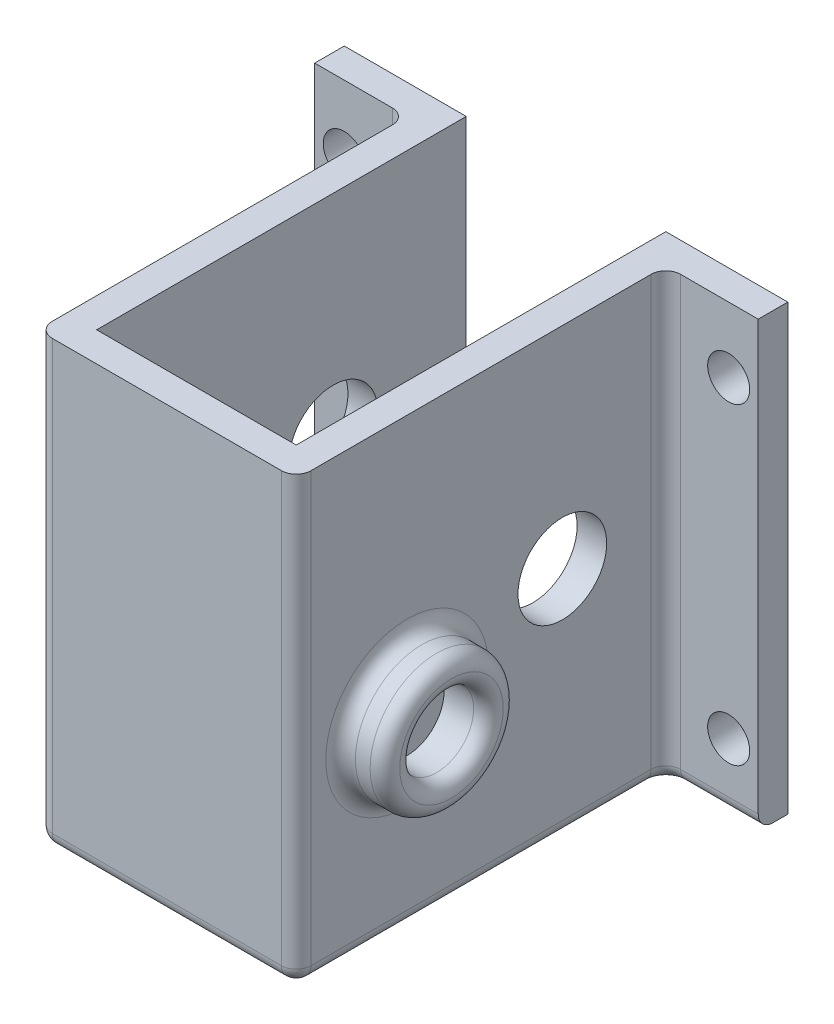
ISO-10303-21;
HEADER;
FILE_DESCRIPTION(('STEP AP214'),'2;1');
FILE_NAME('part.step','',(''),(''),'','','');
FILE_SCHEMA(('AUTOMOTIVE_DESIGN { 1 0 10303 214 1 1 1 1 }'));
ENDSEC;
DATA;
#1=APPLICATION_CONTEXT('core data for automotive mechanical design processes');
#2=APPLICATION_PROTOCOL_DEFINITION('international standard','automotive_design',2000,#1);
#3=PRODUCT_CONTEXT('',#1,'mechanical');
#4=PRODUCT('Part','Part','',(#3));
#5=PRODUCT_RELATED_PRODUCT_CATEGORY('part','',(#4));
#6=PRODUCT_DEFINITION_FORMATION('','',#4);
#7=PRODUCT_DEFINITION_CONTEXT('part definition',#1,'design');
#8=PRODUCT_DEFINITION('design','',#6,#7);
#9=PRODUCT_DEFINITION_SHAPE('','',#8);
#10=(LENGTH_UNIT() NAMED_UNIT(*) SI_UNIT(.MILLI.,.METRE.));
#11=(NAMED_UNIT(*) PLANE_ANGLE_UNIT() SI_UNIT($,.RADIAN.));
#12=(NAMED_UNIT(*) SI_UNIT($,.STERADIAN.) SOLID_ANGLE_UNIT());
#13=UNCERTAINTY_MEASURE_WITH_UNIT(LENGTH_MEASURE(1.E-05),#10,'distance_accuracy_value','');
#14=(GEOMETRIC_REPRESENTATION_CONTEXT(3) GLOBAL_UNCERTAINTY_ASSIGNED_CONTEXT((#13)) GLOBAL_UNIT_ASSIGNED_CONTEXT((#10,
#11,#12)) REPRESENTATION_CONTEXT('',''));
#15=CARTESIAN_POINT('',(0.,0.,0.));
#16=DIRECTION('',(0.,0.,1.));
#17=DIRECTION('',(1.,0.,0.));
#18=AXIS2_PLACEMENT_3D('',#15,#16,#17);
#19=CARTESIAN_POINT('',(-8.75,2.,13.5));
#20=DIRECTION('',(1.,0.,0.));
#21=DIRECTION('',(0.,0.,-1.));
#22=AXIS2_PLACEMENT_3D('',#19,#20,#21);
#23=PLANE('',#22);
#24=CARTESIAN_POINT('',(-8.75,15.76,-4.5));
#25=DIRECTION('',(1.,0.,0.));
#26=DIRECTION('',(0.,0.,-1.));
#27=AXIS2_PLACEMENT_3D('',#24,#25,#26);
#28=CIRCLE('',#27,3.);
#29=CARTESIAN_POINT('',(-8.75,15.76,-7.5));
#30=VERTEX_POINT('',#29);
#31=EDGE_CURVE('E203',#30,#30,#28,.T.);
#32=ORIENTED_EDGE('',*,*,#31,.T.);
#33=EDGE_LOOP('',(#32));
#34=FACE_BOUND('',#33,.T.);
#35=DIRECTION('',(0.,0.,1.));
#36=VECTOR('',#35,1.);
#37=CARTESIAN_POINT('',(-8.75,30.,-13.5));
#38=LINE('',#37,#36);
#39=CARTESIAN_POINT('',(-8.75,30.,-10.5));
#40=VERTEX_POINT('',#39);
#41=CARTESIAN_POINT('',(-8.75,30.,12.5));
#42=VERTEX_POINT('',#41);
#43=EDGE_CURVE('E244',#40,#42,#38,.T.);
#44=ORIENTED_EDGE('',*,*,#43,.F.);
#45=DIRECTION('',(0.,1.,0.));
#46=VECTOR('',#45,1.);
#47=CARTESIAN_POINT('',(-8.75,0.,-10.5));
#48=LINE('',#47,#46);
#49=CARTESIAN_POINT('',(-8.75,1.,-10.5));
#50=VERTEX_POINT('',#49);
#51=EDGE_CURVE('E360',#40,#50,#48,.F.);
#52=ORIENTED_EDGE('',*,*,#51,.T.);
#53=DIRECTION('',(0.,0.,1.));
#54=VECTOR('',#53,1.);
#55=CARTESIAN_POINT('',(-8.75,1.,13.5));
#56=LINE('',#55,#54);
#57=CARTESIAN_POINT('',(-8.75,1.,12.5));
#58=VERTEX_POINT('',#57);
#59=EDGE_CURVE('E357',#50,#58,#56,.T.);
#60=ORIENTED_EDGE('',*,*,#59,.T.);
#61=DIRECTION('',(0.,-1.,0.));
#62=VECTOR('',#61,1.);
#63=CARTESIAN_POINT('',(-8.75,2.,12.5));
#64=LINE('',#63,#62);
#65=EDGE_CURVE('E354',#58,#42,#64,.F.);
#66=ORIENTED_EDGE('',*,*,#65,.T.);
#67=EDGE_LOOP('',(#44,#52,#60,#66));
#68=FACE_BOUND('',#67,.T.);
#69=ADVANCED_FACE('F41',(#34,#68),#23,.F.);
#70=CARTESIAN_POINT('',(8.75,2.,13.5));
#71=DIRECTION('',(0.,0.,-1.));
#72=DIRECTION('',(-1.,0.,0.));
#73=AXIS2_PLACEMENT_3D('',#70,#71,#72);
#74=PLANE('',#73);
#75=DIRECTION('',(1.,0.,0.));
#76=VECTOR('',#75,1.);
#77=CARTESIAN_POINT('',(-8.75,30.,13.5));
#78=LINE('',#77,#76);
#79=CARTESIAN_POINT('',(-7.75,30.,13.5));
#80=VERTEX_POINT('',#79);
#81=CARTESIAN_POINT('',(7.75,30.,13.5));
#82=VERTEX_POINT('',#81);
#83=EDGE_CURVE('E248',#80,#82,#78,.T.);
#84=ORIENTED_EDGE('',*,*,#83,.F.);
#85=DIRECTION('',(0.,-1.,0.));
#86=VECTOR('',#85,1.);
#87=CARTESIAN_POINT('',(-7.75,2.,13.5));
#88=LINE('',#87,#86);
#89=CARTESIAN_POINT('',(-7.75,1.,13.5));
#90=VERTEX_POINT('',#89);
#91=EDGE_CURVE('E59',#80,#90,#88,.T.);
#92=ORIENTED_EDGE('',*,*,#91,.T.);
#93=DIRECTION('',(1.,0.,0.));
#94=VECTOR('',#93,1.);
#95=CARTESIAN_POINT('',(8.75,1.,13.5));
#96=LINE('',#95,#94);
#97=CARTESIAN_POINT('',(7.75,1.,13.5));
#98=VERTEX_POINT('',#97);
#99=EDGE_CURVE('E64',#90,#98,#96,.T.);
#100=ORIENTED_EDGE('',*,*,#99,.T.);
#101=DIRECTION('',(0.,-1.,0.));
#102=VECTOR('',#101,1.);
#103=CARTESIAN_POINT('',(7.75,2.,13.5));
#104=LINE('',#103,#102);
#105=EDGE_CURVE('E363',#98,#82,#104,.F.);
#106=ORIENTED_EDGE('',*,*,#105,.T.);
#107=EDGE_LOOP('',(#84,#92,#100,#106));
#108=FACE_BOUND('',#107,.T.);
#109=ADVANCED_FACE('F519',(#108),#74,.F.);
#110=CARTESIAN_POINT('',(8.75,2.,13.5));
#111=DIRECTION('',(-1.,0.,0.));
#112=DIRECTION('',(0.,0.,1.));
#113=AXIS2_PLACEMENT_3D('',#110,#111,#112);
#114=PLANE('',#113);
#115=CARTESIAN_POINT('',(8.75,12.56,6.00000000000001));
#116=DIRECTION('',(-1.,0.,0.));
#117=DIRECTION('',(0.,0.,1.));
#118=AXIS2_PLACEMENT_3D('',#115,#116,#117);
#119=CIRCLE('',#118,5.5);
#120=CARTESIAN_POINT('',(8.75,12.56,11.5));
#121=VERTEX_POINT('',#120);
#122=EDGE_CURVE('E341',#121,#121,#119,.T.);
#123=ORIENTED_EDGE('',*,*,#122,.T.);
#124=EDGE_LOOP('',(#123));
#125=FACE_BOUND('',#124,.T.);
#126=CARTESIAN_POINT('',(8.75,15.76,-4.5));
#127=DIRECTION('',(-1.,0.,0.));
#128=DIRECTION('',(0.,0.,1.));
#129=AXIS2_PLACEMENT_3D('',#126,#127,#128);
#130=CIRCLE('',#129,3.);
#131=CARTESIAN_POINT('',(8.75,15.76,-1.5));
#132=VERTEX_POINT('',#131);
#133=EDGE_CURVE('E494',#132,#132,#130,.T.);
#134=ORIENTED_EDGE('',*,*,#133,.T.);
#135=EDGE_LOOP('',(#134));
#136=FACE_BOUND('',#135,.T.);
#137=DIRECTION('',(0.,0.,-1.));
#138=VECTOR('',#137,1.);
#139=CARTESIAN_POINT('',(8.75,1.,13.5));
#140=LINE('',#139,#138);
#141=CARTESIAN_POINT('',(8.75,1.,12.5));
#142=VERTEX_POINT('',#141);
#143=CARTESIAN_POINT('',(8.75,1.,-10.5));
#144=VERTEX_POINT('',#143);
#145=EDGE_CURVE('E348',#142,#144,#140,.T.);
#146=ORIENTED_EDGE('',*,*,#145,.T.);
#147=DIRECTION('',(0.,1.,0.));
#148=VECTOR('',#147,1.);
#149=CARTESIAN_POINT('',(8.75,2.,-10.5));
#150=LINE('',#149,#148);
#151=CARTESIAN_POINT('',(8.75,30.,-10.5));
#152=VERTEX_POINT('',#151);
#153=EDGE_CURVE('E351',#144,#152,#150,.T.);
#154=ORIENTED_EDGE('',*,*,#153,.T.);
#155=DIRECTION('',(0.,0.,-1.));
#156=VECTOR('',#155,1.);
#157=CARTESIAN_POINT('',(8.75,30.,13.5));
#158=LINE('',#157,#156);
#159=CARTESIAN_POINT('',(8.75,30.,12.5));
#160=VERTEX_POINT('',#159);
#161=EDGE_CURVE('E193',#160,#152,#158,.T.);
#162=ORIENTED_EDGE('',*,*,#161,.F.);
#163=DIRECTION('',(0.,-1.,0.));
#164=VECTOR('',#163,1.);
#165=CARTESIAN_POINT('',(8.75,2.,12.5));
#166=LINE('',#165,#164);
#167=EDGE_CURVE('E345',#160,#142,#166,.T.);
#168=ORIENTED_EDGE('',*,*,#167,.T.);
#169=EDGE_LOOP('',(#146,#154,#162,#168));
#170=FACE_BOUND('',#169,.T.);
#171=ADVANCED_FACE('F524',(#125,#136,#170),#114,.F.);
#172=CARTESIAN_POINT('',(8.75,2.,-13.5));
#173=DIRECTION('',(0.,0.,1.));
#174=DIRECTION('',(1.,0.,0.));
#175=AXIS2_PLACEMENT_3D('',#172,#173,#174);
#176=PLANE('',#175);
#177=CARTESIAN_POINT('',(-13.,25.5776,-13.5));
#178=DIRECTION('',(0.,0.,1.));
#179=DIRECTION('',(1.,0.,0.));
#180=AXIS2_PLACEMENT_3D('',#177,#178,#179);
#181=CIRCLE('',#180,1.4224);
#182=CARTESIAN_POINT('',(-11.5776,25.5776,-13.5));
#183=VERTEX_POINT('',#182);
#184=EDGE_CURVE('E456',#183,#183,#181,.T.);
#185=ORIENTED_EDGE('',*,*,#184,.T.);
#186=EDGE_LOOP('',(#185));
#187=FACE_BOUND('',#186,.T.);
#188=CARTESIAN_POINT('',(-13.,4.42239999999999,-13.5));
#189=DIRECTION('',(0.,0.,1.));
#190=DIRECTION('',(1.,0.,0.));
#191=AXIS2_PLACEMENT_3D('',#188,#189,#190);
#192=CIRCLE('',#191,1.4224);
#193=CARTESIAN_POINT('',(-11.5776,4.42239999999999,-13.5));
#194=VERTEX_POINT('',#193);
#195=EDGE_CURVE('E464',#194,#194,#192,.T.);
#196=ORIENTED_EDGE('',*,*,#195,.T.);
#197=EDGE_LOOP('',(#196));
#198=FACE_BOUND('',#197,.T.);
#199=CARTESIAN_POINT('',(13.,4.42239999999999,-13.5));
#200=DIRECTION('',(0.,0.,1.));
#201=DIRECTION('',(1.,0.,0.));
#202=AXIS2_PLACEMENT_3D('',#199,#200,#201);
#203=CIRCLE('',#202,1.4224);
#204=CARTESIAN_POINT('',(14.4224,4.42239999999999,-13.5));
#205=VERTEX_POINT('',#204);
#206=EDGE_CURVE('E472',#205,#205,#203,.T.);
#207=ORIENTED_EDGE('',*,*,#206,.T.);
#208=EDGE_LOOP('',(#207));
#209=FACE_BOUND('',#208,.T.);
#210=CARTESIAN_POINT('',(13.,25.5776,-13.5));
#211=DIRECTION('',(0.,0.,1.));
#212=DIRECTION('',(1.,0.,0.));
#213=AXIS2_PLACEMENT_3D('',#210,#211,#212);
#214=CIRCLE('',#213,1.4224);
#215=CARTESIAN_POINT('',(14.4224,25.5776,-13.5));
#216=VERTEX_POINT('',#215);
#217=EDGE_CURVE('E480',#216,#216,#214,.T.);
#218=ORIENTED_EDGE('',*,*,#217,.T.);
#219=EDGE_LOOP('',(#218));
#220=FACE_BOUND('',#219,.T.);
#221=DIRECTION('',(-1.,0.,0.));
#222=VECTOR('',#221,1.);
#223=CARTESIAN_POINT('',(8.75,0.,-13.5));
#224=LINE('',#223,#222);
#225=CARTESIAN_POINT('',(15.,0.,-13.5));
#226=VERTEX_POINT('',#225);
#227=CARTESIAN_POINT('',(-15.,0.,-13.5));
#228=VERTEX_POINT('',#227);
#229=EDGE_CURVE('E287',#226,#228,#224,.T.);
#230=ORIENTED_EDGE('',*,*,#229,.T.);
#231=DIRECTION('',(0.,-1.,0.));
#232=VECTOR('',#231,1.);
#233=CARTESIAN_POINT('',(-15.,30.,-13.5));
#234=LINE('',#233,#232);
#235=CARTESIAN_POINT('',(-15.,30.,-13.5));
#236=VERTEX_POINT('',#235);
#237=EDGE_CURVE('E221',#236,#228,#234,.T.);
#238=ORIENTED_EDGE('',*,*,#237,.F.);
#239=DIRECTION('',(-1.,0.,0.));
#240=VECTOR('',#239,1.);
#241=CARTESIAN_POINT('',(-8.75,30.,-13.5));
#242=LINE('',#241,#240);
#243=CARTESIAN_POINT('',(-6.75,30.,-13.5));
#244=VERTEX_POINT('',#243);
#245=EDGE_CURVE('E241',#244,#236,#242,.T.);
#246=ORIENTED_EDGE('',*,*,#245,.F.);
#247=DIRECTION('',(0.,-1.,0.));
#248=VECTOR('',#247,1.);
#249=CARTESIAN_POINT('',(-6.75,30.,-13.5));
#250=LINE('',#249,#248);
#251=CARTESIAN_POINT('',(-6.75,2.,-13.5));
#252=VERTEX_POINT('',#251);
#253=EDGE_CURVE('E263',#244,#252,#250,.T.);
#254=ORIENTED_EDGE('',*,*,#253,.T.);
#255=DIRECTION('',(-1.,0.,0.));
#256=VECTOR('',#255,1.);
#257=CARTESIAN_POINT('',(8.75,2.,-13.5));
#258=LINE('',#257,#256);
#259=CARTESIAN_POINT('',(6.75,2.,-13.5));
#260=VERTEX_POINT('',#259);
#261=EDGE_CURVE('E288',#260,#252,#258,.T.);
#262=ORIENTED_EDGE('',*,*,#261,.F.);
#263=DIRECTION('',(0.,-1.,0.));
#264=VECTOR('',#263,1.);
#265=CARTESIAN_POINT('',(6.75,30.,-13.5));
#266=LINE('',#265,#264);
#267=CARTESIAN_POINT('',(6.75,30.,-13.5));
#268=VERTEX_POINT('',#267);
#269=EDGE_CURVE('E187',#268,#260,#266,.T.);
#270=ORIENTED_EDGE('',*,*,#269,.F.);
#271=DIRECTION('',(-1.,0.,0.));
#272=VECTOR('',#271,1.);
#273=CARTESIAN_POINT('',(6.75,30.,-13.5));
#274=LINE('',#273,#272);
#275=CARTESIAN_POINT('',(15.,30.,-13.5));
#276=VERTEX_POINT('',#275);
#277=EDGE_CURVE('E180',#276,#268,#274,.T.);
#278=ORIENTED_EDGE('',*,*,#277,.F.);
#279=DIRECTION('',(0.,-1.,0.));
#280=VECTOR('',#279,1.);
#281=CARTESIAN_POINT('',(15.,30.,-13.5));
#282=LINE('',#281,#280);
#283=EDGE_CURVE('E183',#276,#226,#282,.T.);
#284=ORIENTED_EDGE('',*,*,#283,.T.);
#285=EDGE_LOOP('',(#230,#238,#246,#254,#262,#270,#278,#284));
#286=FACE_BOUND('',#285,.T.);
#287=ADVANCED_FACE('F182',(#187,#198,#209,#220,#286),#176,.F.);
#288=CARTESIAN_POINT('',(0.,2.,0.));
#289=DIRECTION('',(0.,1.,0.));
#290=DIRECTION('',(0.,0.,1.));
#291=AXIS2_PLACEMENT_3D('',#288,#289,#290);
#292=PLANE('',#291);
#293=CARTESIAN_POINT('',(3.4,2.,2.5));
#294=DIRECTION('',(0.,1.,0.));
#295=DIRECTION('',(0.,0.,1.));
#296=AXIS2_PLACEMENT_3D('',#293,#294,#295);
#297=CIRCLE('',#296,3.);
#298=CARTESIAN_POINT('',(3.4,2.,5.5));
#299=VERTEX_POINT('',#298);
#300=EDGE_CURVE('E299',#299,#299,#297,.T.);
#301=ORIENTED_EDGE('',*,*,#300,.F.);
#302=EDGE_LOOP('',(#301));
#303=FACE_BOUND('',#302,.T.);
#304=DIRECTION('',(0.,0.,-1.));
#305=VECTOR('',#304,1.);
#306=CARTESIAN_POINT('',(-6.75,2.,-13.5));
#307=LINE('',#306,#305);
#308=CARTESIAN_POINT('',(-6.75,2.,11.5));
#309=VERTEX_POINT('',#308);
#310=EDGE_CURVE('E245',#309,#252,#307,.T.);
#311=ORIENTED_EDGE('',*,*,#310,.F.);
#312=DIRECTION('',(-1.,0.,0.));
#313=VECTOR('',#312,1.);
#314=CARTESIAN_POINT('',(-6.75,2.,11.5));
#315=LINE('',#314,#313);
#316=CARTESIAN_POINT('',(6.75,2.,11.5));
#317=VERTEX_POINT('',#316);
#318=EDGE_CURVE('E267',#317,#309,#315,.T.);
#319=ORIENTED_EDGE('',*,*,#318,.F.);
#320=DIRECTION('',(0.,0.,1.));
#321=VECTOR('',#320,1.);
#322=CARTESIAN_POINT('',(6.75,2.,11.5));
#323=LINE('',#322,#321);
#324=EDGE_CURVE('E240',#260,#317,#323,.T.);
#325=ORIENTED_EDGE('',*,*,#324,.F.);
#326=ORIENTED_EDGE('',*,*,#261,.T.);
#327=EDGE_LOOP('',(#311,#319,#325,#326));
#328=FACE_BOUND('',#327,.T.);
#329=ADVANCED_FACE('F617',(#303,#328),#292,.T.);
#330=CARTESIAN_POINT('',(0.,0.,0.));
#331=DIRECTION('',(0.,1.,0.));
#332=DIRECTION('',(0.,0.,1.));
#333=AXIS2_PLACEMENT_3D('',#330,#331,#332);
#334=PLANE('',#333);
#335=CARTESIAN_POINT('',(3.4,0.,2.5));
#336=DIRECTION('',(0.,1.,0.));
#337=DIRECTION('',(0.,0.,1.));
#338=AXIS2_PLACEMENT_3D('',#335,#336,#337);
#339=CIRCLE('',#338,3.);
#340=CARTESIAN_POINT('',(3.4,0.,5.5));
#341=VERTEX_POINT('',#340);
#342=EDGE_CURVE('E484',#341,#341,#339,.T.);
#343=ORIENTED_EDGE('',*,*,#342,.T.);
#344=EDGE_LOOP('',(#343));
#345=FACE_BOUND('',#344,.T.);
#346=CARTESIAN_POINT('',(-9.75,0.,-10.5));
#347=DIRECTION('',(0.,1.,0.));
#348=DIRECTION('',(0.,0.,1.));
#349=AXIS2_PLACEMENT_3D('',#346,#347,#348);
#350=CIRCLE('',#349,2.);
#351=CARTESIAN_POINT('',(-9.75,0.,-12.5));
#352=VERTEX_POINT('',#351);
#353=CARTESIAN_POINT('',(-7.75,0.,-10.5));
#354=VERTEX_POINT('',#353);
#355=EDGE_CURVE('E316',#352,#354,#350,.F.);
#356=ORIENTED_EDGE('',*,*,#355,.F.);
#357=DIRECTION('',(1.,0.,0.));
#358=VECTOR('',#357,1.);
#359=CARTESIAN_POINT('',(0.,0.,-12.5));
#360=LINE('',#359,#358);
#361=CARTESIAN_POINT('',(-15.,0.,-12.5));
#362=VERTEX_POINT('',#361);
#363=EDGE_CURVE('E320',#352,#362,#360,.F.);
#364=ORIENTED_EDGE('',*,*,#363,.T.);
#365=DIRECTION('',(0.,0.,1.));
#366=VECTOR('',#365,1.);
#367=CARTESIAN_POINT('',(-15.,0.,-13.5));
#368=LINE('',#367,#366);
#369=EDGE_CURVE('E225',#228,#362,#368,.T.);
#370=ORIENTED_EDGE('',*,*,#369,.F.);
#371=ORIENTED_EDGE('',*,*,#229,.F.);
#372=DIRECTION('',(0.,0.,1.));
#373=VECTOR('',#372,1.);
#374=CARTESIAN_POINT('',(15.,0.,-13.5));
#375=LINE('',#374,#373);
#376=CARTESIAN_POINT('',(15.,0.,-12.5));
#377=VERTEX_POINT('',#376);
#378=EDGE_CURVE('E201',#226,#377,#375,.T.);
#379=ORIENTED_EDGE('',*,*,#378,.T.);
#380=DIRECTION('',(-1.,0.,0.));
#381=VECTOR('',#380,1.);
#382=CARTESIAN_POINT('',(8.75,0.,-12.5));
#383=LINE('',#382,#381);
#384=CARTESIAN_POINT('',(9.75,0.,-12.5));
#385=VERTEX_POINT('',#384);
#386=EDGE_CURVE('E312',#377,#385,#383,.T.);
#387=ORIENTED_EDGE('',*,*,#386,.T.);
#388=CARTESIAN_POINT('',(9.75,0.,-10.5));
#389=DIRECTION('',(0.,1.,0.));
#390=DIRECTION('',(0.,0.,1.));
#391=AXIS2_PLACEMENT_3D('',#388,#389,#390);
#392=CIRCLE('',#391,2.);
#393=CARTESIAN_POINT('',(7.75,0.,-10.5));
#394=VERTEX_POINT('',#393);
#395=EDGE_CURVE('E308',#394,#385,#392,.F.);
#396=ORIENTED_EDGE('',*,*,#395,.F.);
#397=DIRECTION('',(0.,0.,-1.));
#398=VECTOR('',#397,1.);
#399=CARTESIAN_POINT('',(7.75,0.,0.));
#400=LINE('',#399,#398);
#401=CARTESIAN_POINT('',(7.75,0.,12.5));
#402=VERTEX_POINT('',#401);
#403=EDGE_CURVE('E302',#394,#402,#400,.F.);
#404=ORIENTED_EDGE('',*,*,#403,.T.);
#405=DIRECTION('',(1.,0.,0.));
#406=VECTOR('',#405,1.);
#407=CARTESIAN_POINT('',(0.,0.,12.5));
#408=LINE('',#407,#406);
#409=CARTESIAN_POINT('',(-7.75,0.,12.5));
#410=VERTEX_POINT('',#409);
#411=EDGE_CURVE('E291',#402,#410,#408,.F.);
#412=ORIENTED_EDGE('',*,*,#411,.T.);
#413=DIRECTION('',(0.,0.,1.));
#414=VECTOR('',#413,1.);
#415=CARTESIAN_POINT('',(-7.75,0.,0.));
#416=LINE('',#415,#414);
#417=EDGE_CURVE('E305',#410,#354,#416,.F.);
#418=ORIENTED_EDGE('',*,*,#417,.T.);
#419=EDGE_LOOP('',(#356,#364,#370,#371,#379,#387,#396,#404,#412,#418));
#420=FACE_BOUND('',#419,.T.);
#421=ADVANCED_FACE('F639',(#345,#420),#334,.F.);
#422=CARTESIAN_POINT('',(6.75,30.,11.5));
#423=DIRECTION('',(1.,0.,0.));
#424=DIRECTION('',(0.,0.,-1.));
#425=AXIS2_PLACEMENT_3D('',#422,#423,#424);
#426=PLANE('',#425);
#427=CARTESIAN_POINT('',(6.75,12.56,6.00000000000001));
#428=DIRECTION('',(1.,0.,0.));
#429=DIRECTION('',(0.,0.,-1.));
#430=AXIS2_PLACEMENT_3D('',#427,#428,#429);
#431=CIRCLE('',#430,0.500000000000001);
#432=CARTESIAN_POINT('',(6.75,12.56,5.50000000000001));
#433=VERTEX_POINT('',#432);
#434=EDGE_CURVE('E440',#433,#433,#431,.F.);
#435=ORIENTED_EDGE('',*,*,#434,.F.);
#436=EDGE_LOOP('',(#435));
#437=FACE_BOUND('',#436,.T.);
#438=CARTESIAN_POINT('',(6.75,15.76,-4.5));
#439=DIRECTION('',(1.,0.,0.));
#440=DIRECTION('',(0.,0.,-1.));
#441=AXIS2_PLACEMENT_3D('',#438,#439,#440);
#442=CIRCLE('',#441,3.);
#443=CARTESIAN_POINT('',(6.75,15.76,-7.5));
#444=VERTEX_POINT('',#443);
#445=EDGE_CURVE('E298',#444,#444,#442,.T.);
#446=ORIENTED_EDGE('',*,*,#445,.T.);
#447=EDGE_LOOP('',(#446));
#448=FACE_BOUND('',#447,.T.);
#449=ORIENTED_EDGE('',*,*,#324,.T.);
#450=DIRECTION('',(0.,-1.,0.));
#451=VECTOR('',#450,1.);
#452=CARTESIAN_POINT('',(6.75,30.,11.5));
#453=LINE('',#452,#451);
#454=CARTESIAN_POINT('',(6.75,30.,11.5));
#455=VERTEX_POINT('',#454);
#456=EDGE_CURVE('E281',#455,#317,#453,.T.);
#457=ORIENTED_EDGE('',*,*,#456,.F.);
#458=DIRECTION('',(0.,0.,1.));
#459=VECTOR('',#458,1.);
#460=CARTESIAN_POINT('',(6.75,30.,11.5));
#461=LINE('',#460,#459);
#462=EDGE_CURVE('E192',#268,#455,#461,.T.);
#463=ORIENTED_EDGE('',*,*,#462,.F.);
#464=ORIENTED_EDGE('',*,*,#269,.T.);
#465=EDGE_LOOP('',(#449,#457,#463,#464));
#466=FACE_BOUND('',#465,.T.);
#467=ADVANCED_FACE('F658',(#437,#448,#466),#426,.F.);
#468=CARTESIAN_POINT('',(-6.75,30.,11.5));
#469=DIRECTION('',(0.,0.,1.));
#470=DIRECTION('',(1.,0.,0.));
#471=AXIS2_PLACEMENT_3D('',#468,#469,#470);
#472=PLANE('',#471);
#473=ORIENTED_EDGE('',*,*,#318,.T.);
#474=DIRECTION('',(0.,-1.,0.));
#475=VECTOR('',#474,1.);
#476=CARTESIAN_POINT('',(-6.75,30.,11.5));
#477=LINE('',#476,#475);
#478=CARTESIAN_POINT('',(-6.75,30.,11.5));
#479=VERTEX_POINT('',#478);
#480=EDGE_CURVE('E277',#479,#309,#477,.T.);
#481=ORIENTED_EDGE('',*,*,#480,.F.);
#482=DIRECTION('',(-1.,0.,0.));
#483=VECTOR('',#482,1.);
#484=CARTESIAN_POINT('',(-6.75,30.,11.5));
#485=LINE('',#484,#483);
#486=EDGE_CURVE('E257',#455,#479,#485,.T.);
#487=ORIENTED_EDGE('',*,*,#486,.F.);
#488=ORIENTED_EDGE('',*,*,#456,.T.);
#489=EDGE_LOOP('',(#473,#481,#487,#488));
#490=FACE_BOUND('',#489,.T.);
#491=ADVANCED_FACE('F661',(#490),#472,.F.);
#492=CARTESIAN_POINT('',(-6.75,30.,-13.5));
#493=DIRECTION('',(-1.,0.,0.));
#494=DIRECTION('',(0.,0.,1.));
#495=AXIS2_PLACEMENT_3D('',#492,#493,#494);
#496=PLANE('',#495);
#497=CARTESIAN_POINT('',(-6.75,15.76,-4.5));
#498=DIRECTION('',(-1.,0.,0.));
#499=DIRECTION('',(0.,0.,1.));
#500=AXIS2_PLACEMENT_3D('',#497,#498,#499);
#501=CIRCLE('',#500,3.);
#502=CARTESIAN_POINT('',(-6.75,15.76,-1.5));
#503=VERTEX_POINT('',#502);
#504=EDGE_CURVE('E294',#503,#503,#501,.T.);
#505=ORIENTED_EDGE('',*,*,#504,.T.);
#506=EDGE_LOOP('',(#505));
#507=FACE_BOUND('',#506,.T.);
#508=ORIENTED_EDGE('',*,*,#310,.T.);
#509=ORIENTED_EDGE('',*,*,#253,.F.);
#510=DIRECTION('',(0.,0.,-1.));
#511=VECTOR('',#510,1.);
#512=CARTESIAN_POINT('',(-6.75,30.,-13.5));
#513=LINE('',#512,#511);
#514=EDGE_CURVE('E260',#479,#244,#513,.T.);
#515=ORIENTED_EDGE('',*,*,#514,.F.);
#516=ORIENTED_EDGE('',*,*,#480,.T.);
#517=EDGE_LOOP('',(#508,#509,#515,#516));
#518=FACE_BOUND('',#517,.T.);
#519=ADVANCED_FACE('F655',(#507,#518),#496,.F.);
#520=CARTESIAN_POINT('',(0.,30.,0.));
#521=DIRECTION('',(0.,-1.,0.));
#522=DIRECTION('',(0.,0.,-1.));
#523=AXIS2_PLACEMENT_3D('',#520,#521,#522);
#524=PLANE('',#523);
#525=ORIENTED_EDGE('',*,*,#43,.T.);
#526=CARTESIAN_POINT('',(-7.75,30.,12.5));
#527=DIRECTION('',(0.,-1.,0.));
#528=DIRECTION('',(0.,0.,-1.));
#529=AXIS2_PLACEMENT_3D('',#526,#527,#528);
#530=CIRCLE('',#529,1.);
#531=EDGE_CURVE('E373',#42,#80,#530,.F.);
#532=ORIENTED_EDGE('',*,*,#531,.T.);
#533=ORIENTED_EDGE('',*,*,#83,.T.);
#534=CARTESIAN_POINT('',(7.75,30.,12.5));
#535=DIRECTION('',(0.,-1.,0.));
#536=DIRECTION('',(0.,0.,-1.));
#537=AXIS2_PLACEMENT_3D('',#534,#535,#536);
#538=CIRCLE('',#537,1.);
#539=EDGE_CURVE('E370',#82,#160,#538,.F.);
#540=ORIENTED_EDGE('',*,*,#539,.T.);
#541=ORIENTED_EDGE('',*,*,#161,.T.);
#542=CARTESIAN_POINT('',(9.75,30.,-10.5));
#543=DIRECTION('',(0.,-1.,0.));
#544=DIRECTION('',(0.,0.,-1.));
#545=AXIS2_PLACEMENT_3D('',#542,#543,#544);
#546=CIRCLE('',#545,1.);
#547=CARTESIAN_POINT('',(9.75,30.,-11.5));
#548=VERTEX_POINT('',#547);
#549=EDGE_CURVE('E51',#152,#548,#546,.T.);
#550=ORIENTED_EDGE('',*,*,#549,.T.);
#551=DIRECTION('',(-1.,0.,0.));
#552=VECTOR('',#551,1.);
#553=CARTESIAN_POINT('',(15.,30.,-11.5));
#554=LINE('',#553,#552);
#555=CARTESIAN_POINT('',(15.,30.,-11.5));
#556=VERTEX_POINT('',#555);
#557=EDGE_CURVE('E209',#556,#548,#554,.T.);
#558=ORIENTED_EDGE('',*,*,#557,.F.);
#559=DIRECTION('',(0.,0.,-1.));
#560=VECTOR('',#559,1.);
#561=CARTESIAN_POINT('',(15.,30.,-13.5));
#562=LINE('',#561,#560);
#563=EDGE_CURVE('E199',#556,#276,#562,.T.);
#564=ORIENTED_EDGE('',*,*,#563,.T.);
#565=ORIENTED_EDGE('',*,*,#277,.T.);
#566=ORIENTED_EDGE('',*,*,#462,.T.);
#567=ORIENTED_EDGE('',*,*,#486,.T.);
#568=ORIENTED_EDGE('',*,*,#514,.T.);
#569=ORIENTED_EDGE('',*,*,#245,.T.);
#570=DIRECTION('',(0.,0.,-1.));
#571=VECTOR('',#570,1.);
#572=CARTESIAN_POINT('',(-15.,30.,-13.5));
#573=LINE('',#572,#571);
#574=CARTESIAN_POINT('',(-15.,30.,-11.5));
#575=VERTEX_POINT('',#574);
#576=EDGE_CURVE('E232',#575,#236,#573,.T.);
#577=ORIENTED_EDGE('',*,*,#576,.F.);
#578=DIRECTION('',(1.,0.,0.));
#579=VECTOR('',#578,1.);
#580=CARTESIAN_POINT('',(-15.,30.,-11.5));
#581=LINE('',#580,#579);
#582=CARTESIAN_POINT('',(-9.75,30.,-11.5));
#583=VERTEX_POINT('',#582);
#584=EDGE_CURVE('E236',#575,#583,#581,.T.);
#585=ORIENTED_EDGE('',*,*,#584,.T.);
#586=CARTESIAN_POINT('',(-9.75,30.,-10.5));
#587=DIRECTION('',(0.,-1.,0.));
#588=DIRECTION('',(0.,0.,-1.));
#589=AXIS2_PLACEMENT_3D('',#586,#587,#588);
#590=CIRCLE('',#589,1.);
#591=EDGE_CURVE('E11',#583,#40,#590,.T.);
#592=ORIENTED_EDGE('',*,*,#591,.T.);
#593=EDGE_LOOP('',(#525,#532,#533,#540,#541,#550,#558,#564,#565,#566,#567,#568,#569,#577,#585,#592));
#594=FACE_BOUND('',#593,.T.);
#595=ADVANCED_FACE('F207',(#594),#524,.F.);
#596=CARTESIAN_POINT('',(-15.,30.,-11.5));
#597=DIRECTION('',(0.,0.,-1.));
#598=DIRECTION('',(0.,1.,0.));
#599=AXIS2_PLACEMENT_3D('',#596,#597,#598);
#600=PLANE('',#599);
#601=CARTESIAN_POINT('',(-13.,25.5776,-11.5));
#602=DIRECTION('',(0.,0.,1.));
#603=DIRECTION('',(1.,0.,0.));
#604=AXIS2_PLACEMENT_3D('',#601,#602,#603);
#605=CIRCLE('',#604,1.4224);
#606=CARTESIAN_POINT('',(-11.5776,25.5776,-11.5));
#607=VERTEX_POINT('',#606);
#608=EDGE_CURVE('E452',#607,#607,#605,.T.);
#609=ORIENTED_EDGE('',*,*,#608,.F.);
#610=EDGE_LOOP('',(#609));
#611=FACE_BOUND('',#610,.T.);
#612=CARTESIAN_POINT('',(-13.,4.42239999999999,-11.5));
#613=DIRECTION('',(0.,0.,1.));
#614=DIRECTION('',(1.,0.,0.));
#615=AXIS2_PLACEMENT_3D('',#612,#613,#614);
#616=CIRCLE('',#615,1.4224);
#617=CARTESIAN_POINT('',(-11.5776,4.42239999999999,-11.5));
#618=VERTEX_POINT('',#617);
#619=EDGE_CURVE('E460',#618,#618,#616,.T.);
#620=ORIENTED_EDGE('',*,*,#619,.F.);
#621=EDGE_LOOP('',(#620));
#622=FACE_BOUND('',#621,.T.);
#623=DIRECTION('',(0.,1.,0.));
#624=VECTOR('',#623,1.);
#625=CARTESIAN_POINT('',(-15.,30.,-11.5));
#626=LINE('',#625,#624);
#627=CARTESIAN_POINT('',(-15.,1.,-11.5));
#628=VERTEX_POINT('',#627);
#629=EDGE_CURVE('E229',#628,#575,#626,.T.);
#630=ORIENTED_EDGE('',*,*,#629,.F.);
#631=DIRECTION('',(1.,0.,0.));
#632=VECTOR('',#631,1.);
#633=CARTESIAN_POINT('',(-15.,1.,-11.5));
#634=LINE('',#633,#632);
#635=CARTESIAN_POINT('',(-9.75,1.,-11.5));
#636=VERTEX_POINT('',#635);
#637=EDGE_CURVE('E335',#628,#636,#634,.T.);
#638=ORIENTED_EDGE('',*,*,#637,.T.);
#639=DIRECTION('',(0.,1.,0.));
#640=VECTOR('',#639,1.);
#641=CARTESIAN_POINT('',(-9.75,30.,-11.5));
#642=LINE('',#641,#640);
#643=EDGE_CURVE('E332',#636,#583,#642,.T.);
#644=ORIENTED_EDGE('',*,*,#643,.T.);
#645=ORIENTED_EDGE('',*,*,#584,.F.);
#646=EDGE_LOOP('',(#630,#638,#644,#645));
#647=FACE_BOUND('',#646,.T.);
#648=ADVANCED_FACE('F682',(#611,#622,#647),#600,.F.);
#649=CARTESIAN_POINT('',(-15.,0.,0.));
#650=DIRECTION('',(-1.,0.,0.));
#651=DIRECTION('',(0.,0.,1.));
#652=AXIS2_PLACEMENT_3D('',#649,#650,#651);
#653=PLANE('',#652);
#654=ORIENTED_EDGE('',*,*,#369,.T.);
#655=CARTESIAN_POINT('',(-15.,1.,-12.5));
#656=DIRECTION('',(-1.,0.,0.));
#657=DIRECTION('',(0.,0.,1.));
#658=AXIS2_PLACEMENT_3D('',#655,#656,#657);
#659=CIRCLE('',#658,1.);
#660=EDGE_CURVE('E338',#362,#628,#659,.T.);
#661=ORIENTED_EDGE('',*,*,#660,.T.);
#662=ORIENTED_EDGE('',*,*,#629,.T.);
#663=ORIENTED_EDGE('',*,*,#576,.T.);
#664=ORIENTED_EDGE('',*,*,#237,.T.);
#665=EDGE_LOOP('',(#654,#661,#662,#663,#664));
#666=FACE_BOUND('',#665,.T.);
#667=ADVANCED_FACE('F644',(#666),#653,.T.);
#668=CARTESIAN_POINT('',(15.,30.,-11.5));
#669=DIRECTION('',(0.,0.,1.));
#670=DIRECTION('',(0.,-1.,0.));
#671=AXIS2_PLACEMENT_3D('',#668,#669,#670);
#672=PLANE('',#671);
#673=CARTESIAN_POINT('',(13.,4.42239999999999,-11.5));
#674=DIRECTION('',(0.,0.,1.));
#675=DIRECTION('',(1.,0.,0.));
#676=AXIS2_PLACEMENT_3D('',#673,#674,#675);
#677=CIRCLE('',#676,1.4224);
#678=CARTESIAN_POINT('',(14.4224,4.42239999999999,-11.5));
#679=VERTEX_POINT('',#678);
#680=EDGE_CURVE('E468',#679,#679,#677,.T.);
#681=ORIENTED_EDGE('',*,*,#680,.F.);
#682=EDGE_LOOP('',(#681));
#683=FACE_BOUND('',#682,.T.);
#684=CARTESIAN_POINT('',(13.,25.5776,-11.5));
#685=DIRECTION('',(0.,0.,1.));
#686=DIRECTION('',(1.,0.,0.));
#687=AXIS2_PLACEMENT_3D('',#684,#685,#686);
#688=CIRCLE('',#687,1.4224);
#689=CARTESIAN_POINT('',(14.4224,25.5776,-11.5));
#690=VERTEX_POINT('',#689);
#691=EDGE_CURVE('E476',#690,#690,#688,.T.);
#692=ORIENTED_EDGE('',*,*,#691,.F.);
#693=EDGE_LOOP('',(#692));
#694=FACE_BOUND('',#693,.T.);
#695=DIRECTION('',(0.,1.,0.));
#696=VECTOR('',#695,1.);
#697=CARTESIAN_POINT('',(9.75,30.,-11.5));
#698=LINE('',#697,#696);
#699=CARTESIAN_POINT('',(9.75,1.,-11.5));
#700=VERTEX_POINT('',#699);
#701=EDGE_CURVE('E323',#548,#700,#698,.F.);
#702=ORIENTED_EDGE('',*,*,#701,.T.);
#703=DIRECTION('',(-1.,0.,0.));
#704=VECTOR('',#703,1.);
#705=CARTESIAN_POINT('',(15.,1.,-11.5));
#706=LINE('',#705,#704);
#707=CARTESIAN_POINT('',(15.,1.,-11.5));
#708=VERTEX_POINT('',#707);
#709=EDGE_CURVE('E326',#700,#708,#706,.F.);
#710=ORIENTED_EDGE('',*,*,#709,.T.);
#711=DIRECTION('',(0.,1.,0.));
#712=VECTOR('',#711,1.);
#713=CARTESIAN_POINT('',(15.,30.,-11.5));
#714=LINE('',#713,#712);
#715=EDGE_CURVE('E211',#708,#556,#714,.T.);
#716=ORIENTED_EDGE('',*,*,#715,.T.);
#717=ORIENTED_EDGE('',*,*,#557,.T.);
#718=EDGE_LOOP('',(#702,#710,#716,#717));
#719=FACE_BOUND('',#718,.T.);
#720=ADVANCED_FACE('F514',(#683,#694,#719),#672,.T.);
#721=CARTESIAN_POINT('',(15.,0.,0.));
#722=DIRECTION('',(1.,0.,0.));
#723=DIRECTION('',(0.,0.,1.));
#724=AXIS2_PLACEMENT_3D('',#721,#722,#723);
#725=PLANE('',#724);
#726=ORIENTED_EDGE('',*,*,#715,.F.);
#727=CARTESIAN_POINT('',(15.,1.,-12.5));
#728=DIRECTION('',(1.,0.,0.));
#729=DIRECTION('',(0.,0.,-1.));
#730=AXIS2_PLACEMENT_3D('',#727,#728,#729);
#731=CIRCLE('',#730,1.);
#732=EDGE_CURVE('E329',#708,#377,#731,.T.);
#733=ORIENTED_EDGE('',*,*,#732,.T.);
#734=ORIENTED_EDGE('',*,*,#378,.F.);
#735=ORIENTED_EDGE('',*,*,#283,.F.);
#736=ORIENTED_EDGE('',*,*,#563,.F.);
#737=EDGE_LOOP('',(#726,#733,#734,#735,#736));
#738=FACE_BOUND('',#737,.T.);
#739=ADVANCED_FACE('F198',(#738),#725,.T.);
#740=CARTESIAN_POINT('',(15.,15.76,-4.5));
#741=DIRECTION('',(-1.,0.,0.));
#742=DIRECTION('',(0.,0.,1.));
#743=AXIS2_PLACEMENT_3D('',#740,#741,#742);
#744=CYLINDRICAL_SURFACE('',#743,3.);
#745=ORIENTED_EDGE('',*,*,#504,.F.);
#746=EDGE_LOOP('',(#745));
#747=FACE_BOUND('',#746,.T.);
#748=ORIENTED_EDGE('',*,*,#31,.F.);
#749=EDGE_LOOP('',(#748));
#750=FACE_BOUND('',#749,.T.);
#751=ADVANCED_FACE('F503',(#747,#750),#744,.F.);
#752=ORIENTED_EDGE('',*,*,#445,.F.);
#753=EDGE_LOOP('',(#752));
#754=FACE_BOUND('',#753,.T.);
#755=ORIENTED_EDGE('',*,*,#133,.F.);
#756=EDGE_LOOP('',(#755));
#757=FACE_BOUND('',#756,.T.);
#758=ADVANCED_FACE('F505',(#754,#757),#744,.F.);
#759=CARTESIAN_POINT('',(3.4,0.,2.5));
#760=DIRECTION('',(0.,1.,0.));
#761=DIRECTION('',(0.,0.,1.));
#762=AXIS2_PLACEMENT_3D('',#759,#760,#761);
#763=CYLINDRICAL_SURFACE('',#762,3.);
#764=ORIENTED_EDGE('',*,*,#300,.T.);
#765=EDGE_LOOP('',(#764));
#766=FACE_BOUND('',#765,.T.);
#767=ORIENTED_EDGE('',*,*,#342,.F.);
#768=EDGE_LOOP('',(#767));
#769=FACE_BOUND('',#768,.T.);
#770=ADVANCED_FACE('F512',(#766,#769),#763,.F.);
#771=CARTESIAN_POINT('',(13.,25.5776,-11.5));
#772=DIRECTION('',(0.,0.,1.));
#773=DIRECTION('',(1.,0.,0.));
#774=AXIS2_PLACEMENT_3D('',#771,#772,#773);
#775=CYLINDRICAL_SURFACE('',#774,1.4224);
#776=ORIENTED_EDGE('',*,*,#217,.F.);
#777=EDGE_LOOP('',(#776));
#778=FACE_BOUND('',#777,.T.);
#779=ORIENTED_EDGE('',*,*,#691,.T.);
#780=EDGE_LOOP('',(#779));
#781=FACE_BOUND('',#780,.T.);
#782=ADVANCED_FACE('F696',(#778,#781),#775,.F.);
#783=CARTESIAN_POINT('',(13.,4.42239999999999,-11.5));
#784=DIRECTION('',(0.,0.,1.));
#785=DIRECTION('',(1.,0.,0.));
#786=AXIS2_PLACEMENT_3D('',#783,#784,#785);
#787=CYLINDRICAL_SURFACE('',#786,1.4224);
#788=ORIENTED_EDGE('',*,*,#206,.F.);
#789=EDGE_LOOP('',(#788));
#790=FACE_BOUND('',#789,.T.);
#791=ORIENTED_EDGE('',*,*,#680,.T.);
#792=EDGE_LOOP('',(#791));
#793=FACE_BOUND('',#792,.T.);
#794=ADVANCED_FACE('F698',(#790,#793),#787,.F.);
#795=CARTESIAN_POINT('',(-13.,4.42239999999999,-11.5));
#796=DIRECTION('',(0.,0.,1.));
#797=DIRECTION('',(1.,0.,0.));
#798=AXIS2_PLACEMENT_3D('',#795,#796,#797);
#799=CYLINDRICAL_SURFACE('',#798,1.4224);
#800=ORIENTED_EDGE('',*,*,#195,.F.);
#801=EDGE_LOOP('',(#800));
#802=FACE_BOUND('',#801,.T.);
#803=ORIENTED_EDGE('',*,*,#619,.T.);
#804=EDGE_LOOP('',(#803));
#805=FACE_BOUND('',#804,.T.);
#806=ADVANCED_FACE('F705',(#802,#805),#799,.F.);
#807=CARTESIAN_POINT('',(-13.,25.5776,-11.5));
#808=DIRECTION('',(0.,0.,1.));
#809=DIRECTION('',(1.,0.,0.));
#810=AXIS2_PLACEMENT_3D('',#807,#808,#809);
#811=CYLINDRICAL_SURFACE('',#810,1.4224);
#812=ORIENTED_EDGE('',*,*,#184,.F.);
#813=EDGE_LOOP('',(#812));
#814=FACE_BOUND('',#813,.T.);
#815=ORIENTED_EDGE('',*,*,#608,.T.);
#816=EDGE_LOOP('',(#815));
#817=FACE_BOUND('',#816,.T.);
#818=ADVANCED_FACE('F713',(#814,#817),#811,.F.);
#819=CARTESIAN_POINT('',(11.75,12.56,6.00000000000001));
#820=DIRECTION('',(-1.,0.,0.));
#821=DIRECTION('',(0.,0.,1.));
#822=AXIS2_PLACEMENT_3D('',#819,#820,#821);
#823=CYLINDRICAL_SURFACE('',#822,4.5);
#824=CARTESIAN_POINT('',(10.75,12.56,6.00000000000001));
#825=DIRECTION('',(1.,0.,0.));
#826=DIRECTION('',(0.,0.,-1.));
#827=AXIS2_PLACEMENT_3D('',#824,#825,#826);
#828=CIRCLE('',#827,4.5);
#829=CARTESIAN_POINT('',(10.75,12.56,1.50000000000001));
#830=VERTEX_POINT('',#829);
#831=EDGE_CURVE('E384',#830,#830,#828,.F.);
#832=ORIENTED_EDGE('',*,*,#831,.T.);
#833=EDGE_LOOP('',(#832));
#834=FACE_BOUND('',#833,.T.);
#835=CARTESIAN_POINT('',(9.75,12.56,6.00000000000001));
#836=DIRECTION('',(-1.,0.,0.));
#837=DIRECTION('',(0.,0.,1.));
#838=AXIS2_PLACEMENT_3D('',#835,#836,#837);
#839=CIRCLE('',#838,4.5);
#840=CARTESIAN_POINT('',(9.75,12.56,10.5));
#841=VERTEX_POINT('',#840);
#842=EDGE_CURVE('E380',#841,#841,#839,.F.);
#843=ORIENTED_EDGE('',*,*,#842,.T.);
#844=EDGE_LOOP('',(#843));
#845=FACE_BOUND('',#844,.T.);
#846=ADVANCED_FACE('F600',(#834,#845),#823,.T.);
#847=CARTESIAN_POINT('',(11.75,12.56,6.00000000000001));
#848=DIRECTION('',(-1.,0.,0.));
#849=DIRECTION('',(0.,0.,1.));
#850=AXIS2_PLACEMENT_3D('',#847,#848,#849);
#851=CYLINDRICAL_SURFACE('',#850,2.5);
#852=CARTESIAN_POINT('',(10.75,12.56,6.00000000000001));
#853=DIRECTION('',(1.,0.,0.));
#854=DIRECTION('',(0.,0.,-1.));
#855=AXIS2_PLACEMENT_3D('',#852,#853,#854);
#856=CIRCLE('',#855,2.5);
#857=CARTESIAN_POINT('',(10.75,12.56,3.5));
#858=VERTEX_POINT('',#857);
#859=EDGE_CURVE('E376',#858,#858,#856,.T.);
#860=ORIENTED_EDGE('',*,*,#859,.T.);
#861=EDGE_LOOP('',(#860));
#862=FACE_BOUND('',#861,.T.);
#863=CARTESIAN_POINT('',(8.75,12.56,6.00000000000001));
#864=DIRECTION('',(1.,0.,0.));
#865=DIRECTION('',(0.,0.,-1.));
#866=AXIS2_PLACEMENT_3D('',#863,#864,#865);
#867=CIRCLE('',#866,2.5);
#868=CARTESIAN_POINT('',(8.75,12.56,3.5));
#869=VERTEX_POINT('',#868);
#870=EDGE_CURVE('E446',#869,#869,#867,.T.);
#871=ORIENTED_EDGE('',*,*,#870,.F.);
#872=EDGE_LOOP('',(#871));
#873=FACE_BOUND('',#872,.T.);
#874=ADVANCED_FACE('F596',(#862,#873),#851,.F.);
#875=CARTESIAN_POINT('',(8.75,12.56,6.00000000000001));
#876=DIRECTION('',(1.,0.,0.));
#877=DIRECTION('',(0.,0.,-1.));
#878=AXIS2_PLACEMENT_3D('',#875,#876,#877);
#879=CIRCLE('',#878,0.500000000000001);
#880=CARTESIAN_POINT('',(8.75,12.56,5.50000000000001));
#881=VERTEX_POINT('',#880);
#882=EDGE_CURVE('E435',#881,#881,#879,.T.);
#883=ORIENTED_EDGE('',*,*,#882,.F.);
#884=EDGE_LOOP('',(#883));
#885=FACE_BOUND('',#884,.T.);
#886=ORIENTED_EDGE('',*,*,#870,.T.);
#887=EDGE_LOOP('',(#886));
#888=FACE_BOUND('',#887,.T.);
#889=ADVANCED_FACE('F599',(#885,#888),#114,.F.);
#890=CARTESIAN_POINT('',(5.3357864376269,12.56,6.00000000000001));
#891=DIRECTION('',(1.,0.,0.));
#892=DIRECTION('',(0.,0.,-1.));
#893=AXIS2_PLACEMENT_3D('',#890,#891,#892);
#894=CYLINDRICAL_SURFACE('',#893,0.500000000000001);
#895=ORIENTED_EDGE('',*,*,#434,.T.);
#896=EDGE_LOOP('',(#895));
#897=FACE_BOUND('',#896,.T.);
#898=ORIENTED_EDGE('',*,*,#882,.T.);
#899=EDGE_LOOP('',(#898));
#900=FACE_BOUND('',#899,.T.);
#901=ADVANCED_FACE('F579',(#897,#900),#894,.F.);
#902=CARTESIAN_POINT('',(-15.,1.,-12.5));
#903=DIRECTION('',(1.,0.,0.));
#904=DIRECTION('',(0.,0.,-1.));
#905=AXIS2_PLACEMENT_3D('',#902,#903,#904);
#906=CYLINDRICAL_SURFACE('',#905,1.);
#907=ORIENTED_EDGE('',*,*,#660,.F.);
#908=ORIENTED_EDGE('',*,*,#363,.F.);
#909=CARTESIAN_POINT('',(-9.75,1.,-12.5));
#910=DIRECTION('',(1.,0.,0.));
#911=DIRECTION('',(0.,0.,-1.));
#912=AXIS2_PLACEMENT_3D('',#909,#910,#911);
#913=CIRCLE('',#912,1.);
#914=EDGE_CURVE('E432',#636,#352,#913,.T.);
#915=ORIENTED_EDGE('',*,*,#914,.F.);
#916=ORIENTED_EDGE('',*,*,#637,.F.);
#917=EDGE_LOOP('',(#907,#908,#915,#916));
#918=FACE_BOUND('',#917,.T.);
#919=ADVANCED_FACE('F575',(#918),#906,.T.);
#920=CARTESIAN_POINT('',(-9.75,30.,-10.5));
#921=DIRECTION('',(0.,-1.,0.));
#922=DIRECTION('',(0.,0.,-1.));
#923=AXIS2_PLACEMENT_3D('',#920,#921,#922);
#924=CYLINDRICAL_SURFACE('',#923,1.);
#925=ORIENTED_EDGE('',*,*,#591,.F.);
#926=ORIENTED_EDGE('',*,*,#643,.F.);
#927=CARTESIAN_POINT('',(-9.75,1.,-10.5));
#928=DIRECTION('',(0.,1.,0.));
#929=DIRECTION('',(0.,0.,1.));
#930=AXIS2_PLACEMENT_3D('',#927,#928,#929);
#931=CIRCLE('',#930,1.);
#932=EDGE_CURVE('E429',#50,#636,#931,.T.);
#933=ORIENTED_EDGE('',*,*,#932,.F.);
#934=ORIENTED_EDGE('',*,*,#51,.F.);
#935=EDGE_LOOP('',(#925,#926,#933,#934));
#936=FACE_BOUND('',#935,.T.);
#937=ADVANCED_FACE('F572',(#936),#924,.F.);
#938=CARTESIAN_POINT('',(-9.75,1.,-10.5));
#939=DIRECTION('',(0.,1.,0.));
#940=DIRECTION('',(0.,0.,1.));
#941=AXIS2_PLACEMENT_3D('',#938,#939,#940);
#942=TOROIDAL_SURFACE('',#941,2.,1.);
#943=ORIENTED_EDGE('',*,*,#914,.T.);
#944=ORIENTED_EDGE('',*,*,#355,.T.);
#945=CARTESIAN_POINT('',(-7.75,1.,-10.5));
#946=DIRECTION('',(0.,0.,-1.));
#947=DIRECTION('',(-1.,0.,0.));
#948=AXIS2_PLACEMENT_3D('',#945,#946,#947);
#949=CIRCLE('',#948,1.);
#950=EDGE_CURVE('E425',#50,#354,#949,.F.);
#951=ORIENTED_EDGE('',*,*,#950,.F.);
#952=ORIENTED_EDGE('',*,*,#932,.T.);
#953=EDGE_LOOP('',(#943,#944,#951,#952));
#954=FACE_BOUND('',#953,.T.);
#955=ADVANCED_FACE('F568',(#954),#942,.T.);
#956=CARTESIAN_POINT('',(-7.75,1.,13.5));
#957=DIRECTION('',(0.,0.,1.));
#958=DIRECTION('',(1.,0.,0.));
#959=AXIS2_PLACEMENT_3D('',#956,#957,#958);
#960=CYLINDRICAL_SURFACE('',#959,1.);
#961=ORIENTED_EDGE('',*,*,#950,.T.);
#962=ORIENTED_EDGE('',*,*,#417,.F.);
#963=CARTESIAN_POINT('',(-7.75,1.,12.5));
#964=DIRECTION('',(0.,0.,1.));
#965=DIRECTION('',(1.,0.,0.));
#966=AXIS2_PLACEMENT_3D('',#963,#964,#965);
#967=CIRCLE('',#966,1.);
#968=EDGE_CURVE('E421',#58,#410,#967,.T.);
#969=ORIENTED_EDGE('',*,*,#968,.F.);
#970=ORIENTED_EDGE('',*,*,#59,.F.);
#971=EDGE_LOOP('',(#961,#962,#969,#970));
#972=FACE_BOUND('',#971,.T.);
#973=ADVANCED_FACE('F564',(#972),#960,.T.);
#974=CARTESIAN_POINT('',(-7.75,2.,12.5));
#975=DIRECTION('',(0.,-1.,0.));
#976=DIRECTION('',(0.,0.,-1.));
#977=AXIS2_PLACEMENT_3D('',#974,#975,#976);
#978=CYLINDRICAL_SURFACE('',#977,1.);
#979=ORIENTED_EDGE('',*,*,#531,.F.);
#980=ORIENTED_EDGE('',*,*,#65,.F.);
#981=CARTESIAN_POINT('',(-7.75,1.,12.5));
#982=DIRECTION('',(0.,-1.,0.));
#983=DIRECTION('',(0.,0.,-1.));
#984=AXIS2_PLACEMENT_3D('',#981,#982,#983);
#985=CIRCLE('',#984,1.);
#986=EDGE_CURVE('E417',#90,#58,#985,.T.);
#987=ORIENTED_EDGE('',*,*,#986,.F.);
#988=ORIENTED_EDGE('',*,*,#91,.F.);
#989=EDGE_LOOP('',(#979,#980,#987,#988));
#990=FACE_BOUND('',#989,.T.);
#991=ADVANCED_FACE('F560',(#990),#978,.T.);
#992=CARTESIAN_POINT('',(-7.75,1.,12.5));
#993=DIRECTION('',(0.,0.,1.));
#994=DIRECTION('',(1.,0.,0.));
#995=AXIS2_PLACEMENT_3D('',#992,#993,#994);
#996=SPHERICAL_SURFACE('',#995,1.);
#997=ORIENTED_EDGE('',*,*,#986,.T.);
#998=ORIENTED_EDGE('',*,*,#968,.T.);
#999=CARTESIAN_POINT('',(-7.75,1.,12.5));
#1000=DIRECTION('',(-1.,0.,0.));
#1001=DIRECTION('',(0.,0.,1.));
#1002=AXIS2_PLACEMENT_3D('',#999,#1000,#1001);
#1003=CIRCLE('',#1002,1.);
#1004=EDGE_CURVE('E413',#90,#410,#1003,.F.);
#1005=ORIENTED_EDGE('',*,*,#1004,.F.);
#1006=EDGE_LOOP('',(#997,#998,#1005));
#1007=FACE_BOUND('',#1006,.T.);
#1008=ADVANCED_FACE('F556',(#1007),#996,.T.);
#1009=CARTESIAN_POINT('',(8.75,1.,12.5));
#1010=DIRECTION('',(1.,0.,0.));
#1011=DIRECTION('',(0.,0.,-1.));
#1012=AXIS2_PLACEMENT_3D('',#1009,#1010,#1011);
#1013=CYLINDRICAL_SURFACE('',#1012,1.);
#1014=ORIENTED_EDGE('',*,*,#1004,.T.);
#1015=ORIENTED_EDGE('',*,*,#411,.F.);
#1016=CARTESIAN_POINT('',(7.75,1.,12.5));
#1017=DIRECTION('',(1.,0.,0.));
#1018=DIRECTION('',(0.,0.,-1.));
#1019=AXIS2_PLACEMENT_3D('',#1016,#1017,#1018);
#1020=CIRCLE('',#1019,1.);
#1021=EDGE_CURVE('E409',#98,#402,#1020,.T.);
#1022=ORIENTED_EDGE('',*,*,#1021,.F.);
#1023=ORIENTED_EDGE('',*,*,#99,.F.);
#1024=EDGE_LOOP('',(#1014,#1015,#1022,#1023));
#1025=FACE_BOUND('',#1024,.T.);
#1026=ADVANCED_FACE('F552',(#1025),#1013,.T.);
#1027=CARTESIAN_POINT('',(7.75,2.,12.5));
#1028=DIRECTION('',(0.,-1.,0.));
#1029=DIRECTION('',(0.,0.,-1.));
#1030=AXIS2_PLACEMENT_3D('',#1027,#1028,#1029);
#1031=CYLINDRICAL_SURFACE('',#1030,1.);
#1032=ORIENTED_EDGE('',*,*,#539,.F.);
#1033=ORIENTED_EDGE('',*,*,#105,.F.);
#1034=CARTESIAN_POINT('',(7.75,1.,12.5));
#1035=DIRECTION('',(0.,-1.,0.));
#1036=DIRECTION('',(0.,0.,-1.));
#1037=AXIS2_PLACEMENT_3D('',#1034,#1035,#1036);
#1038=CIRCLE('',#1037,1.);
#1039=EDGE_CURVE('E405',#142,#98,#1038,.T.);
#1040=ORIENTED_EDGE('',*,*,#1039,.F.);
#1041=ORIENTED_EDGE('',*,*,#167,.F.);
#1042=EDGE_LOOP('',(#1032,#1033,#1040,#1041));
#1043=FACE_BOUND('',#1042,.T.);
#1044=ADVANCED_FACE('F548',(#1043),#1031,.T.);
#1045=CARTESIAN_POINT('',(7.75,1.,12.5));
#1046=DIRECTION('',(0.,0.,1.));
#1047=DIRECTION('',(1.,0.,0.));
#1048=AXIS2_PLACEMENT_3D('',#1045,#1046,#1047);
#1049=SPHERICAL_SURFACE('',#1048,1.);
#1050=ORIENTED_EDGE('',*,*,#1039,.T.);
#1051=ORIENTED_EDGE('',*,*,#1021,.T.);
#1052=CARTESIAN_POINT('',(7.75,1.,12.5));
#1053=DIRECTION('',(0.,0.,1.));
#1054=DIRECTION('',(1.,0.,0.));
#1055=AXIS2_PLACEMENT_3D('',#1052,#1053,#1054);
#1056=CIRCLE('',#1055,1.);
#1057=EDGE_CURVE('E401',#142,#402,#1056,.F.);
#1058=ORIENTED_EDGE('',*,*,#1057,.F.);
#1059=EDGE_LOOP('',(#1050,#1051,#1058));
#1060=FACE_BOUND('',#1059,.T.);
#1061=ADVANCED_FACE('F544',(#1060),#1049,.T.);
#1062=CARTESIAN_POINT('',(7.75,1.,13.5));
#1063=DIRECTION('',(0.,0.,-1.));
#1064=DIRECTION('',(-1.,0.,0.));
#1065=AXIS2_PLACEMENT_3D('',#1062,#1063,#1064);
#1066=CYLINDRICAL_SURFACE('',#1065,1.);
#1067=ORIENTED_EDGE('',*,*,#1057,.T.);
#1068=ORIENTED_EDGE('',*,*,#403,.F.);
#1069=CARTESIAN_POINT('',(7.75,1.,-10.5));
#1070=DIRECTION('',(0.,0.,-1.));
#1071=DIRECTION('',(-1.,0.,0.));
#1072=AXIS2_PLACEMENT_3D('',#1069,#1070,#1071);
#1073=CIRCLE('',#1072,1.);
#1074=EDGE_CURVE('E397',#144,#394,#1073,.T.);
#1075=ORIENTED_EDGE('',*,*,#1074,.F.);
#1076=ORIENTED_EDGE('',*,*,#145,.F.);
#1077=EDGE_LOOP('',(#1067,#1068,#1075,#1076));
#1078=FACE_BOUND('',#1077,.T.);
#1079=ADVANCED_FACE('F540',(#1078),#1066,.T.);
#1080=CARTESIAN_POINT('',(9.75,2.,-10.5));
#1081=DIRECTION('',(0.,1.,0.));
#1082=DIRECTION('',(0.,0.,1.));
#1083=AXIS2_PLACEMENT_3D('',#1080,#1081,#1082);
#1084=CYLINDRICAL_SURFACE('',#1083,1.);
#1085=ORIENTED_EDGE('',*,*,#549,.F.);
#1086=ORIENTED_EDGE('',*,*,#153,.F.);
#1087=CARTESIAN_POINT('',(9.75,1.,-10.5));
#1088=DIRECTION('',(0.,1.,0.));
#1089=DIRECTION('',(0.,0.,1.));
#1090=AXIS2_PLACEMENT_3D('',#1087,#1088,#1089);
#1091=CIRCLE('',#1090,1.);
#1092=EDGE_CURVE('E393',#700,#144,#1091,.T.);
#1093=ORIENTED_EDGE('',*,*,#1092,.F.);
#1094=ORIENTED_EDGE('',*,*,#701,.F.);
#1095=EDGE_LOOP('',(#1085,#1086,#1093,#1094));
#1096=FACE_BOUND('',#1095,.T.);
#1097=ADVANCED_FACE('F536',(#1096),#1084,.F.);
#1098=CARTESIAN_POINT('',(9.75,1.,-10.5));
#1099=DIRECTION('',(0.,1.,0.));
#1100=DIRECTION('',(0.,0.,1.));
#1101=AXIS2_PLACEMENT_3D('',#1098,#1099,#1100);
#1102=TOROIDAL_SURFACE('',#1101,2.,1.);
#1103=ORIENTED_EDGE('',*,*,#1074,.T.);
#1104=ORIENTED_EDGE('',*,*,#395,.T.);
#1105=CARTESIAN_POINT('',(9.75,1.,-12.5));
#1106=DIRECTION('',(-1.,0.,0.));
#1107=DIRECTION('',(0.,0.,1.));
#1108=AXIS2_PLACEMENT_3D('',#1105,#1106,#1107);
#1109=CIRCLE('',#1108,1.);
#1110=EDGE_CURVE('E390',#700,#385,#1109,.F.);
#1111=ORIENTED_EDGE('',*,*,#1110,.F.);
#1112=ORIENTED_EDGE('',*,*,#1092,.T.);
#1113=EDGE_LOOP('',(#1103,#1104,#1111,#1112));
#1114=FACE_BOUND('',#1113,.T.);
#1115=ADVANCED_FACE('F532',(#1114),#1102,.T.);
#1116=CARTESIAN_POINT('',(0.,1.,-12.5));
#1117=DIRECTION('',(1.,0.,0.));
#1118=DIRECTION('',(0.,0.,-1.));
#1119=AXIS2_PLACEMENT_3D('',#1116,#1117,#1118);
#1120=CYLINDRICAL_SURFACE('',#1119,1.);
#1121=ORIENTED_EDGE('',*,*,#732,.F.);
#1122=ORIENTED_EDGE('',*,*,#709,.F.);
#1123=ORIENTED_EDGE('',*,*,#1110,.T.);
#1124=ORIENTED_EDGE('',*,*,#386,.F.);
#1125=EDGE_LOOP('',(#1121,#1122,#1123,#1124));
#1126=FACE_BOUND('',#1125,.T.);
#1127=ADVANCED_FACE('F528',(#1126),#1120,.T.);
#1128=CARTESIAN_POINT('',(10.75,12.56,6.00000000000001));
#1129=DIRECTION('',(1.,0.,0.));
#1130=DIRECTION('',(0.,0.,-1.));
#1131=AXIS2_PLACEMENT_3D('',#1128,#1129,#1130);
#1132=TOROIDAL_SURFACE('',#1131,3.5,1.);
#1133=ORIENTED_EDGE('',*,*,#831,.F.);
#1134=EDGE_LOOP('',(#1133));
#1135=FACE_BOUND('',#1134,.T.);
#1136=CARTESIAN_POINT('',(11.75,12.56,6.00000000000001));
#1137=DIRECTION('',(1.,0.,0.));
#1138=DIRECTION('',(0.,0.,-1.));
#1139=AXIS2_PLACEMENT_3D('',#1136,#1137,#1138);
#1140=CIRCLE('',#1139,3.5);
#1141=CARTESIAN_POINT('',(11.75,12.56,2.50000000000001));
#1142=VERTEX_POINT('',#1141);
#1143=EDGE_CURVE('E45',#1142,#1142,#1140,.T.);
#1144=ORIENTED_EDGE('',*,*,#1143,.F.);
#1145=EDGE_LOOP('',(#1144));
#1146=FACE_BOUND('',#1145,.T.);
#1147=ADVANCED_FACE('F531',(#1135,#1146),#1132,.T.);
#1148=CARTESIAN_POINT('',(10.75,12.56,6.00000000000001));
#1149=DIRECTION('',(1.,0.,0.));
#1150=DIRECTION('',(0.,0.,-1.));
#1151=AXIS2_PLACEMENT_3D('',#1148,#1149,#1150);
#1152=TOROIDAL_SURFACE('',#1151,3.5,1.);
#1153=ORIENTED_EDGE('',*,*,#1143,.T.);
#1154=EDGE_LOOP('',(#1153));
#1155=FACE_BOUND('',#1154,.T.);
#1156=ORIENTED_EDGE('',*,*,#859,.F.);
#1157=EDGE_LOOP('',(#1156));
#1158=FACE_BOUND('',#1157,.T.);
#1159=ADVANCED_FACE('F581',(#1155,#1158),#1152,.T.);
#1160=CARTESIAN_POINT('',(9.75,12.56,6.00000000000001));
#1161=DIRECTION('',(-1.,0.,0.));
#1162=DIRECTION('',(0.,0.,1.));
#1163=AXIS2_PLACEMENT_3D('',#1160,#1161,#1162);
#1164=TOROIDAL_SURFACE('',#1163,5.5,1.);
#1165=ORIENTED_EDGE('',*,*,#122,.F.);
#1166=EDGE_LOOP('',(#1165));
#1167=FACE_BOUND('',#1166,.T.);
#1168=ORIENTED_EDGE('',*,*,#842,.F.);
#1169=EDGE_LOOP('',(#1168));
#1170=FACE_BOUND('',#1169,.T.);
#1171=ADVANCED_FACE('F43',(#1167,#1170),#1164,.F.);
#1172=CLOSED_SHELL('',(#69,#109,#171,#287,#329,#421,#467,#491,#519,#595,#648,#667,#720,#739,
#751,#758,#770,#782,#794,#806,#818,#846,#874,#889,#901,#919,#937,#955,#973,#991,#1008,#1026,
#1044,#1061,#1079,#1097,#1115,#1127,#1147,#1159,#1171));
#1173=MANIFOLD_SOLID_BREP('B2',#1172);
#1174=ADVANCED_BREP_SHAPE_REPRESENTATION('',(#18,#1173),#14);
#1175=SHAPE_DEFINITION_REPRESENTATION(#9,#1174);
ENDSEC;
END-ISO-10303-21;
